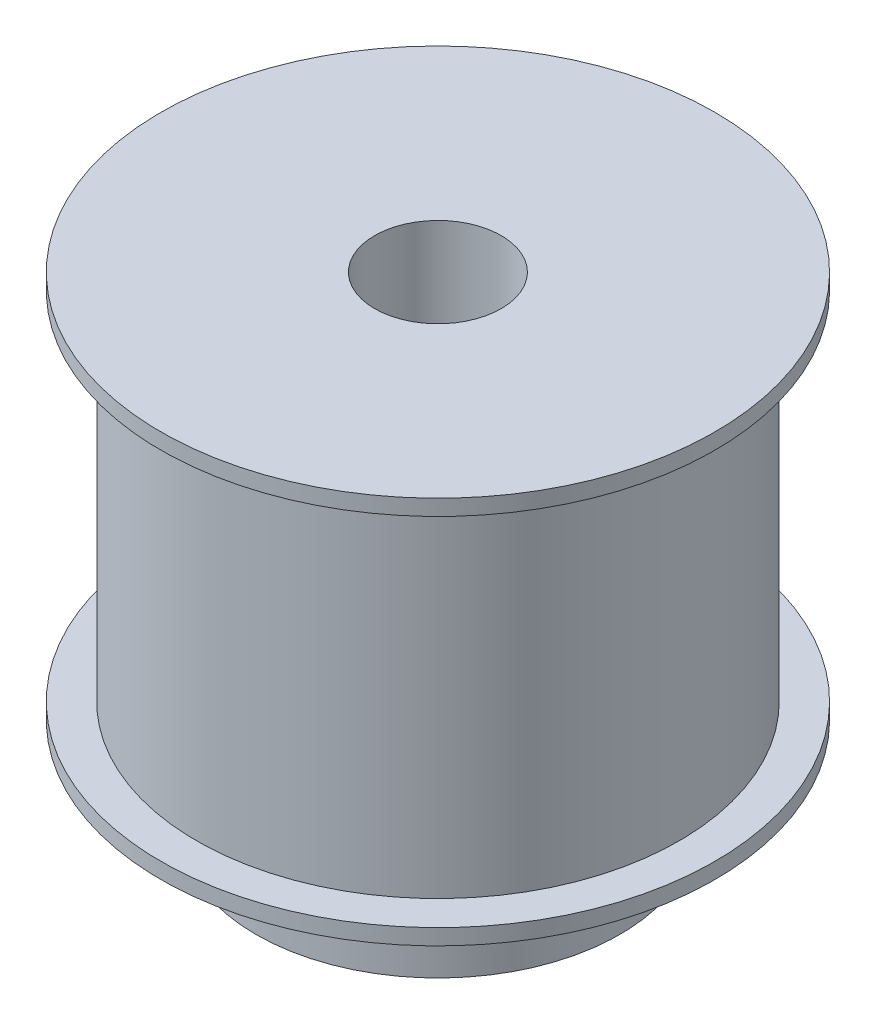
ISO-10303-21;
HEADER;
FILE_DESCRIPTION(('STEP AP214'),'2;1');
FILE_NAME('part.step','',(''),(''),'','','');
FILE_SCHEMA(('AUTOMOTIVE_DESIGN { 1 0 10303 214 1 1 1 1 }'));
ENDSEC;
DATA;
#1=APPLICATION_CONTEXT('core data for automotive mechanical design processes');
#2=APPLICATION_PROTOCOL_DEFINITION('international standard','automotive_design',2000,#1);
#3=PRODUCT_CONTEXT('',#1,'mechanical');
#4=PRODUCT('Part','Part','',(#3));
#5=PRODUCT_RELATED_PRODUCT_CATEGORY('part','',(#4));
#6=PRODUCT_DEFINITION_FORMATION('','',#4);
#7=PRODUCT_DEFINITION_CONTEXT('part definition',#1,'design');
#8=PRODUCT_DEFINITION('design','',#6,#7);
#9=PRODUCT_DEFINITION_SHAPE('','',#8);
#10=(LENGTH_UNIT() NAMED_UNIT(*) SI_UNIT(.MILLI.,.METRE.));
#11=(NAMED_UNIT(*) PLANE_ANGLE_UNIT() SI_UNIT($,.RADIAN.));
#12=(NAMED_UNIT(*) SI_UNIT($,.STERADIAN.) SOLID_ANGLE_UNIT());
#13=UNCERTAINTY_MEASURE_WITH_UNIT(LENGTH_MEASURE(1.E-05),#10,'distance_accuracy_value','');
#14=(GEOMETRIC_REPRESENTATION_CONTEXT(3) GLOBAL_UNCERTAINTY_ASSIGNED_CONTEXT((#13)) GLOBAL_UNIT_ASSIGNED_CONTEXT((#10,
#11,#12)) REPRESENTATION_CONTEXT('',''));
#15=CARTESIAN_POINT('',(0.,0.,0.));
#16=DIRECTION('',(0.,0.,1.));
#17=DIRECTION('',(1.,0.,0.));
#18=AXIS2_PLACEMENT_3D('',#15,#16,#17);
#19=CARTESIAN_POINT('',(0.,-6.,0.));
#20=DIRECTION('',(0.,1.,0.));
#21=DIRECTION('',(0.,0.,1.));
#22=AXIS2_PLACEMENT_3D('',#19,#20,#21);
#23=PLANE('',#22);
#24=CARTESIAN_POINT('',(0.,-6.,0.));
#25=DIRECTION('',(0.,1.,0.));
#26=DIRECTION('',(0.,0.,1.));
#27=AXIS2_PLACEMENT_3D('',#24,#25,#26);
#28=CIRCLE('',#27,4.);
#29=CARTESIAN_POINT('',(0.,-6.,4.));
#30=VERTEX_POINT('',#29);
#31=EDGE_CURVE('E62',#30,#30,#28,.T.);
#32=ORIENTED_EDGE('',*,*,#31,.T.);
#33=EDGE_LOOP('',(#32));
#34=FACE_BOUND('',#33,.T.);
#35=CARTESIAN_POINT('',(0.,-5.99999999999999,0.));
#36=DIRECTION('',(0.,-1.,0.));
#37=DIRECTION('',(0.,0.,-1.));
#38=AXIS2_PLACEMENT_3D('',#35,#36,#37);
#39=CIRCLE('',#38,11.5);
#40=CARTESIAN_POINT('',(0.,-5.99999999999999,-11.5));
#41=VERTEX_POINT('',#40);
#42=EDGE_CURVE('E59',#41,#41,#39,.T.);
#43=ORIENTED_EDGE('',*,*,#42,.T.);
#44=EDGE_LOOP('',(#43));
#45=FACE_BOUND('',#44,.T.);
#46=ADVANCED_FACE('F31',(#34,#45),#23,.F.);
#47=CARTESIAN_POINT('',(0.,24.5,0.));
#48=DIRECTION('',(0.,-1.,0.));
#49=DIRECTION('',(0.,0.,-1.));
#50=AXIS2_PLACEMENT_3D('',#47,#48,#49);
#51=PLANE('',#50);
#52=CARTESIAN_POINT('',(0.,24.5,0.));
#53=DIRECTION('',(0.,1.,0.));
#54=DIRECTION('',(0.,0.,1.));
#55=AXIS2_PLACEMENT_3D('',#52,#53,#54);
#56=CIRCLE('',#55,4.);
#57=CARTESIAN_POINT('',(0.,24.5,4.));
#58=VERTEX_POINT('',#57);
#59=EDGE_CURVE('E63',#58,#58,#56,.T.);
#60=ORIENTED_EDGE('',*,*,#59,.F.);
#61=EDGE_LOOP('',(#60));
#62=FACE_BOUND('',#61,.T.);
#63=CARTESIAN_POINT('',(0.,24.5,0.));
#64=DIRECTION('',(0.,-1.,0.));
#65=DIRECTION('',(0.,0.,-1.));
#66=AXIS2_PLACEMENT_3D('',#63,#64,#65);
#67=CIRCLE('',#66,17.5);
#68=CARTESIAN_POINT('',(0.,24.5,-17.5));
#69=VERTEX_POINT('',#68);
#70=EDGE_CURVE('E10',#69,#69,#67,.T.);
#71=ORIENTED_EDGE('',*,*,#70,.F.);
#72=EDGE_LOOP('',(#71));
#73=FACE_BOUND('',#72,.T.);
#74=ADVANCED_FACE('F78',(#62,#73),#51,.F.);
#75=CARTESIAN_POINT('',(0.,1.,0.));
#76=DIRECTION('',(0.,-1.,0.));
#77=DIRECTION('',(0.,0.,-1.));
#78=AXIS2_PLACEMENT_3D('',#75,#76,#77);
#79=CYLINDRICAL_SURFACE('',#78,17.5);
#80=CARTESIAN_POINT('',(0.,23.5,0.));
#81=DIRECTION('',(0.,-1.,0.));
#82=DIRECTION('',(0.,0.,-1.));
#83=AXIS2_PLACEMENT_3D('',#80,#81,#82);
#84=CIRCLE('',#83,17.5);
#85=CARTESIAN_POINT('',(0.,23.5,-17.5));
#86=VERTEX_POINT('',#85);
#87=EDGE_CURVE('E37',#86,#86,#84,.T.);
#88=ORIENTED_EDGE('',*,*,#87,.F.);
#89=EDGE_LOOP('',(#88));
#90=FACE_BOUND('',#89,.T.);
#91=ORIENTED_EDGE('',*,*,#70,.T.);
#92=EDGE_LOOP('',(#91));
#93=FACE_BOUND('',#92,.T.);
#94=ADVANCED_FACE('F81',(#90,#93),#79,.T.);
#95=CARTESIAN_POINT('',(-15.25,23.5,0.));
#96=DIRECTION('',(0.,1.,0.));
#97=DIRECTION('',(0.,0.,1.));
#98=AXIS2_PLACEMENT_3D('',#95,#96,#97);
#99=PLANE('',#98);
#100=CARTESIAN_POINT('',(0.,23.5,0.));
#101=DIRECTION('',(0.,-1.,0.));
#102=DIRECTION('',(0.,0.,-1.));
#103=AXIS2_PLACEMENT_3D('',#100,#101,#102);
#104=CIRCLE('',#103,15.25);
#105=CARTESIAN_POINT('',(0.,23.5,-15.25));
#106=VERTEX_POINT('',#105);
#107=EDGE_CURVE('E41',#106,#106,#104,.T.);
#108=ORIENTED_EDGE('',*,*,#107,.F.);
#109=EDGE_LOOP('',(#108));
#110=FACE_BOUND('',#109,.T.);
#111=ORIENTED_EDGE('',*,*,#87,.T.);
#112=EDGE_LOOP('',(#111));
#113=FACE_BOUND('',#112,.T.);
#114=ADVANCED_FACE('F86',(#110,#113),#99,.F.);
#115=CARTESIAN_POINT('',(0.,1.,0.));
#116=DIRECTION('',(0.,-1.,0.));
#117=DIRECTION('',(0.,0.,-1.));
#118=AXIS2_PLACEMENT_3D('',#115,#116,#117);
#119=CYLINDRICAL_SURFACE('',#118,15.25);
#120=CARTESIAN_POINT('',(0.,1.,0.));
#121=DIRECTION('',(0.,-1.,0.));
#122=DIRECTION('',(0.,0.,-1.));
#123=AXIS2_PLACEMENT_3D('',#120,#121,#122);
#124=CIRCLE('',#123,15.25);
#125=CARTESIAN_POINT('',(0.,1.,-15.25));
#126=VERTEX_POINT('',#125);
#127=EDGE_CURVE('E45',#126,#126,#124,.T.);
#128=ORIENTED_EDGE('',*,*,#127,.F.);
#129=EDGE_LOOP('',(#128));
#130=FACE_BOUND('',#129,.T.);
#131=ORIENTED_EDGE('',*,*,#107,.T.);
#132=EDGE_LOOP('',(#131));
#133=FACE_BOUND('',#132,.T.);
#134=ADVANCED_FACE('F92',(#130,#133),#119,.T.);
#135=CARTESIAN_POINT('',(-15.25,0.999999999999999,0.));
#136=DIRECTION('',(0.,-1.,0.));
#137=DIRECTION('',(0.,0.,-1.));
#138=AXIS2_PLACEMENT_3D('',#135,#136,#137);
#139=PLANE('',#138);
#140=CARTESIAN_POINT('',(0.,0.999999999999998,0.));
#141=DIRECTION('',(0.,-1.,0.));
#142=DIRECTION('',(0.,0.,-1.));
#143=AXIS2_PLACEMENT_3D('',#140,#141,#142);
#144=CIRCLE('',#143,17.5);
#145=CARTESIAN_POINT('',(0.,0.999999999999998,-17.5));
#146=VERTEX_POINT('',#145);
#147=EDGE_CURVE('E50',#146,#146,#144,.T.);
#148=ORIENTED_EDGE('',*,*,#147,.F.);
#149=EDGE_LOOP('',(#148));
#150=FACE_BOUND('',#149,.T.);
#151=ORIENTED_EDGE('',*,*,#127,.T.);
#152=EDGE_LOOP('',(#151));
#153=FACE_BOUND('',#152,.T.);
#154=ADVANCED_FACE('F96',(#150,#153),#139,.F.);
#155=CARTESIAN_POINT('',(0.,1.,0.));
#156=DIRECTION('',(0.,-1.,0.));
#157=DIRECTION('',(0.,0.,-1.));
#158=AXIS2_PLACEMENT_3D('',#155,#156,#157);
#159=CYLINDRICAL_SURFACE('',#158,17.5);
#160=CARTESIAN_POINT('',(0.,0.,0.));
#161=DIRECTION('',(0.,-1.,0.));
#162=DIRECTION('',(0.,0.,-1.));
#163=AXIS2_PLACEMENT_3D('',#160,#161,#162);
#164=CIRCLE('',#163,17.5);
#165=CARTESIAN_POINT('',(0.,0.,-17.5));
#166=VERTEX_POINT('',#165);
#167=EDGE_CURVE('E53',#166,#166,#164,.T.);
#168=ORIENTED_EDGE('',*,*,#167,.F.);
#169=EDGE_LOOP('',(#168));
#170=FACE_BOUND('',#169,.T.);
#171=ORIENTED_EDGE('',*,*,#147,.T.);
#172=EDGE_LOOP('',(#171));
#173=FACE_BOUND('',#172,.T.);
#174=ADVANCED_FACE('F100',(#170,#173),#159,.T.);
#175=CARTESIAN_POINT('',(-11.5,0.,0.));
#176=DIRECTION('',(0.,1.,0.));
#177=DIRECTION('',(0.,0.,1.));
#178=AXIS2_PLACEMENT_3D('',#175,#176,#177);
#179=PLANE('',#178);
#180=CARTESIAN_POINT('',(0.,0.,0.));
#181=DIRECTION('',(0.,-1.,0.));
#182=DIRECTION('',(0.,0.,-1.));
#183=AXIS2_PLACEMENT_3D('',#180,#181,#182);
#184=CIRCLE('',#183,11.5);
#185=CARTESIAN_POINT('',(0.,0.,-11.5));
#186=VERTEX_POINT('',#185);
#187=EDGE_CURVE('E56',#186,#186,#184,.T.);
#188=ORIENTED_EDGE('',*,*,#187,.F.);
#189=EDGE_LOOP('',(#188));
#190=FACE_BOUND('',#189,.T.);
#191=ORIENTED_EDGE('',*,*,#167,.T.);
#192=EDGE_LOOP('',(#191));
#193=FACE_BOUND('',#192,.T.);
#194=ADVANCED_FACE('F104',(#190,#193),#179,.F.);
#195=CARTESIAN_POINT('',(0.,1.,0.));
#196=DIRECTION('',(0.,-1.,0.));
#197=DIRECTION('',(0.,0.,-1.));
#198=AXIS2_PLACEMENT_3D('',#195,#196,#197);
#199=CYLINDRICAL_SURFACE('',#198,11.5);
#200=ORIENTED_EDGE('',*,*,#42,.F.);
#201=EDGE_LOOP('',(#200));
#202=FACE_BOUND('',#201,.T.);
#203=ORIENTED_EDGE('',*,*,#187,.T.);
#204=EDGE_LOOP('',(#203));
#205=FACE_BOUND('',#204,.T.);
#206=ADVANCED_FACE('F74',(#202,#205),#199,.T.);
#207=CARTESIAN_POINT('',(0.,-6.,0.));
#208=DIRECTION('',(0.,1.,0.));
#209=DIRECTION('',(0.,0.,1.));
#210=AXIS2_PLACEMENT_3D('',#207,#208,#209);
#211=CYLINDRICAL_SURFACE('',#210,4.);
#212=CARTESIAN_POINT('',(0.,-6.,4.));
#213=CARTESIAN_POINT('',(0.,-5.68229166666667,4.));
#214=CARTESIAN_POINT('',(0.,-5.36458333333334,4.));
#215=CARTESIAN_POINT('',(0.,-4.72916666666667,4.));
#216=CARTESIAN_POINT('',(0.,-4.41145833333334,4.));
#217=CARTESIAN_POINT('',(0.,-3.77604166666667,4.));
#218=CARTESIAN_POINT('',(0.,-3.45833333333334,4.));
#219=CARTESIAN_POINT('',(0.,-2.82291666666667,4.));
#220=CARTESIAN_POINT('',(0.,-2.50520833333334,4.));
#221=CARTESIAN_POINT('',(0.,-1.86979166666667,4.));
#222=CARTESIAN_POINT('',(0.,-1.55208333333334,4.));
#223=CARTESIAN_POINT('',(0.,-0.91666666666667,4.));
#224=CARTESIAN_POINT('',(0.,-0.598958333333337,4.));
#225=CARTESIAN_POINT('',(0.,0.0364583333333296,4.));
#226=CARTESIAN_POINT('',(0.,0.354166666666663,4.));
#227=CARTESIAN_POINT('',(0.,0.989583333333329,4.));
#228=CARTESIAN_POINT('',(0.,1.30729166666666,4.));
#229=CARTESIAN_POINT('',(0.,1.94270833333333,4.));
#230=CARTESIAN_POINT('',(0.,2.26041666666666,4.));
#231=CARTESIAN_POINT('',(0.,2.89583333333333,4.));
#232=CARTESIAN_POINT('',(0.,3.21354166666666,4.));
#233=CARTESIAN_POINT('',(0.,3.84895833333333,4.));
#234=CARTESIAN_POINT('',(0.,4.16666666666666,4.));
#235=CARTESIAN_POINT('',(0.,4.80208333333333,4.));
#236=CARTESIAN_POINT('',(0.,5.11979166666666,4.));
#237=CARTESIAN_POINT('',(0.,5.75520833333333,4.));
#238=CARTESIAN_POINT('',(0.,6.07291666666666,4.));
#239=CARTESIAN_POINT('',(0.,6.70833333333333,4.));
#240=CARTESIAN_POINT('',(0.,7.02604166666666,4.));
#241=CARTESIAN_POINT('',(0.,7.66145833333333,4.));
#242=CARTESIAN_POINT('',(0.,7.97916666666666,4.));
#243=CARTESIAN_POINT('',(0.,8.61458333333333,4.));
#244=CARTESIAN_POINT('',(0.,8.93229166666666,4.));
#245=CARTESIAN_POINT('',(0.,9.56770833333333,4.));
#246=CARTESIAN_POINT('',(0.,9.88541666666666,4.));
#247=CARTESIAN_POINT('',(0.,10.5208333333333,4.));
#248=CARTESIAN_POINT('',(0.,10.8385416666667,4.));
#249=CARTESIAN_POINT('',(0.,11.4739583333333,4.));
#250=CARTESIAN_POINT('',(0.,11.7916666666667,4.));
#251=CARTESIAN_POINT('',(0.,12.4270833333333,4.));
#252=CARTESIAN_POINT('',(0.,12.7447916666667,4.));
#253=CARTESIAN_POINT('',(0.,13.3802083333333,4.));
#254=CARTESIAN_POINT('',(0.,13.6979166666667,4.));
#255=CARTESIAN_POINT('',(0.,14.3333333333333,4.));
#256=CARTESIAN_POINT('',(0.,14.6510416666667,4.));
#257=CARTESIAN_POINT('',(0.,15.2864583333333,4.));
#258=CARTESIAN_POINT('',(0.,15.6041666666667,4.));
#259=CARTESIAN_POINT('',(0.,16.2395833333333,4.));
#260=CARTESIAN_POINT('',(0.,16.5572916666667,4.));
#261=CARTESIAN_POINT('',(0.,17.1927083333333,4.));
#262=CARTESIAN_POINT('',(0.,17.5104166666667,4.));
#263=CARTESIAN_POINT('',(0.,18.1458333333333,4.));
#264=CARTESIAN_POINT('',(0.,18.4635416666667,4.));
#265=CARTESIAN_POINT('',(0.,19.0989583333333,4.));
#266=CARTESIAN_POINT('',(0.,19.4166666666667,4.));
#267=CARTESIAN_POINT('',(0.,20.0520833333333,4.));
#268=CARTESIAN_POINT('',(0.,20.3697916666667,4.));
#269=CARTESIAN_POINT('',(0.,21.0052083333333,4.));
#270=CARTESIAN_POINT('',(0.,21.3229166666667,4.));
#271=CARTESIAN_POINT('',(0.,21.9583333333333,4.));
#272=CARTESIAN_POINT('',(0.,22.2760416666667,4.));
#273=CARTESIAN_POINT('',(0.,22.9114583333333,4.));
#274=CARTESIAN_POINT('',(0.,23.2291666666667,4.));
#275=CARTESIAN_POINT('',(0.,23.8645833333333,4.));
#276=CARTESIAN_POINT('',(0.,24.1822916666667,4.));
#277=CARTESIAN_POINT('',(0.,24.5,4.));
#278=B_SPLINE_CURVE_WITH_KNOTS('',3,(#212,#213,#214,#215,#216,#217,#218,#219,#220,#221,#222,
#223,#224,#225,#226,#227,#228,#229,#230,#231,#232,#233,#234,#235,#236,#237,#238,#239,#240,#241,
#242,#243,#244,#245,#246,#247,#248,#249,#250,#251,#252,#253,#254,#255,#256,#257,#258,#259,#260,
#261,#262,#263,#264,#265,#266,#267,#268,#269,#270,#271,#272,#273,#274,#275,#276,#277),
.UNSPECIFIED.,.F.,.F.,(4,2,2,2,2,2,2,2,2,2,2,2,2,2,2,2,2,2,2,2,2,2,2,2,2,2,2,2,2,2,2,2,4),(0.,
0.953125,1.90625,2.859375,3.8125,4.765625,5.71875,6.671875,7.625,8.578125,9.53125,10.484375,
11.4375,12.390625,13.34375,14.296875,15.25,16.203125,17.15625,18.109375,19.0625,20.015625,
20.96875,21.921875,22.875,23.828125,24.78125,25.734375,26.6875,27.640625,28.59375,29.546875,
30.5),.UNSPECIFIED.);
#279=EDGE_CURVE('BSEAM71',#30,#58,#278,.T.);
#280=ORIENTED_EDGE('',*,*,#31,.F.);
#281=ORIENTED_EDGE('',*,*,#59,.T.);
#282=ORIENTED_EDGE('',*,*,#279,.T.);
#283=ORIENTED_EDGE('',*,*,#279,.F.);
#284=EDGE_LOOP('',(#280,#282,#281,#283));
#285=FACE_BOUND('',#284,.T.);
#286=ADVANCED_FACE('F71',(#285),#211,.F.);
#287=CLOSED_SHELL('',(#46,#74,#94,#114,#134,#154,#174,#194,#206,#286));
#288=MANIFOLD_SOLID_BREP('B2',#287);
#289=ADVANCED_BREP_SHAPE_REPRESENTATION('',(#18,#288),#14);
#290=SHAPE_DEFINITION_REPRESENTATION(#9,#289);
ENDSEC;
END-ISO-10303-21;
